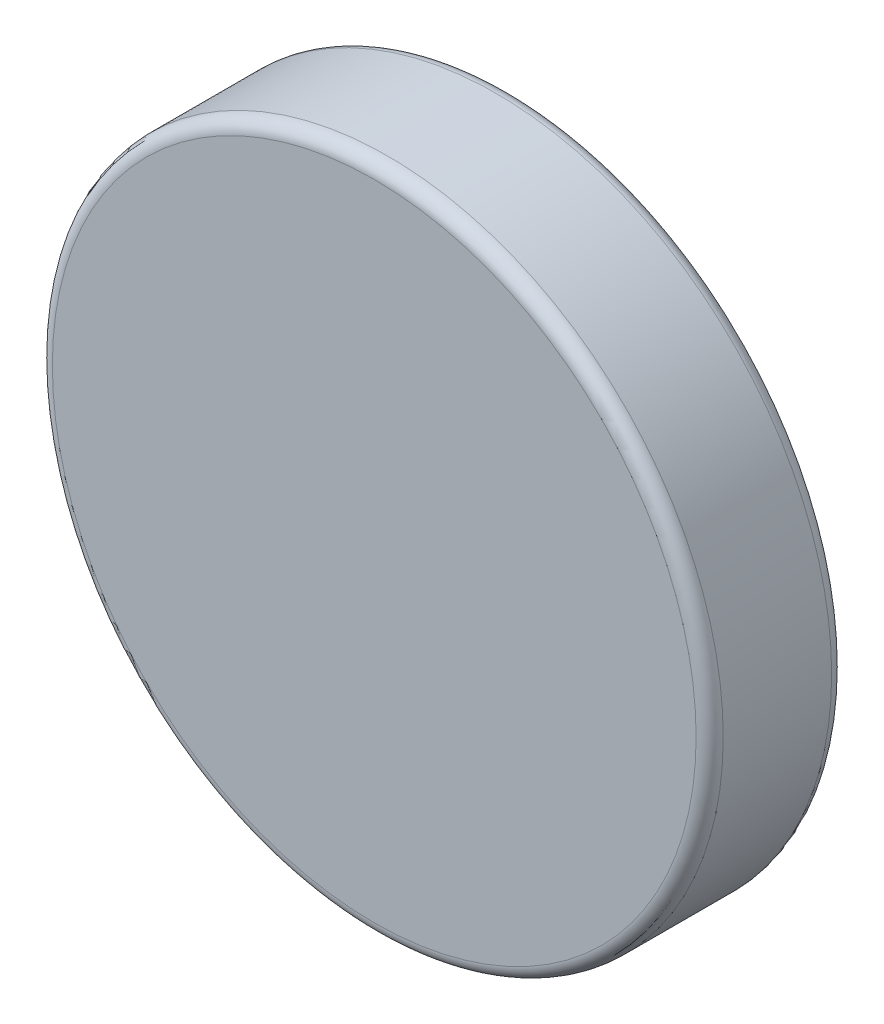
ISO-10303-21;
HEADER;
FILE_DESCRIPTION(('STEP AP214'),'2;1');
FILE_NAME('part.step','',(''),(''),'','','');
FILE_SCHEMA(('AUTOMOTIVE_DESIGN { 1 0 10303 214 1 1 1 1 }'));
ENDSEC;
DATA;
#1=APPLICATION_CONTEXT('core data for automotive mechanical design processes');
#2=APPLICATION_PROTOCOL_DEFINITION('international standard','automotive_design',2000,#1);
#3=PRODUCT_CONTEXT('',#1,'mechanical');
#4=PRODUCT('Part','Part','',(#3));
#5=PRODUCT_RELATED_PRODUCT_CATEGORY('part','',(#4));
#6=PRODUCT_DEFINITION_FORMATION('','',#4);
#7=PRODUCT_DEFINITION_CONTEXT('part definition',#1,'design');
#8=PRODUCT_DEFINITION('design','',#6,#7);
#9=PRODUCT_DEFINITION_SHAPE('','',#8);
#10=(LENGTH_UNIT() NAMED_UNIT(*) SI_UNIT(.MILLI.,.METRE.));
#11=(NAMED_UNIT(*) PLANE_ANGLE_UNIT() SI_UNIT($,.RADIAN.));
#12=(NAMED_UNIT(*) SI_UNIT($,.STERADIAN.) SOLID_ANGLE_UNIT());
#13=UNCERTAINTY_MEASURE_WITH_UNIT(LENGTH_MEASURE(1.E-05),#10,'distance_accuracy_value','');
#14=(GEOMETRIC_REPRESENTATION_CONTEXT(3) GLOBAL_UNCERTAINTY_ASSIGNED_CONTEXT((#13)) GLOBAL_UNIT_ASSIGNED_CONTEXT((#10,
#11,#12)) REPRESENTATION_CONTEXT('',''));
#15=CARTESIAN_POINT('',(0.,0.,0.));
#16=DIRECTION('',(0.,0.,1.));
#17=DIRECTION('',(1.,0.,0.));
#18=AXIS2_PLACEMENT_3D('',#15,#16,#17);
#19=CARTESIAN_POINT('',(0.,0.,2.));
#20=DIRECTION('',(0.,0.,-1.));
#21=DIRECTION('',(-1.,0.,0.));
#22=AXIS2_PLACEMENT_3D('',#19,#20,#21);
#23=CYLINDRICAL_SURFACE('',#22,4.95);
#24=CARTESIAN_POINT('',(0.,0.,0.2));
#25=DIRECTION('',(0.,0.,1.));
#26=DIRECTION('',(1.,0.,0.));
#27=AXIS2_PLACEMENT_3D('',#24,#25,#26);
#28=CIRCLE('',#27,4.95);
#29=CARTESIAN_POINT('',(4.95,0.,0.2));
#30=VERTEX_POINT('',#29);
#31=EDGE_CURVE('E42',#30,#30,#28,.T.);
#32=ORIENTED_EDGE('',*,*,#31,.T.);
#33=EDGE_LOOP('',(#32));
#34=FACE_BOUND('',#33,.T.);
#35=CARTESIAN_POINT('',(0.,0.,1.8));
#36=DIRECTION('',(0.,0.,1.));
#37=DIRECTION('',(1.,0.,0.));
#38=AXIS2_PLACEMENT_3D('',#35,#36,#37);
#39=CIRCLE('',#38,4.95);
#40=CARTESIAN_POINT('',(4.95,0.,1.8));
#41=VERTEX_POINT('',#40);
#42=EDGE_CURVE('E46',#41,#41,#39,.F.);
#43=ORIENTED_EDGE('',*,*,#42,.T.);
#44=EDGE_LOOP('',(#43));
#45=FACE_BOUND('',#44,.T.);
#46=ADVANCED_FACE('F31',(#34,#45),#23,.T.);
#47=CARTESIAN_POINT('',(0.,0.,2.));
#48=DIRECTION('',(0.,0.,1.));
#49=DIRECTION('',(1.,0.,0.));
#50=AXIS2_PLACEMENT_3D('',#47,#48,#49);
#51=PLANE('',#50);
#52=CARTESIAN_POINT('',(0.,0.,2.));
#53=DIRECTION('',(0.,0.,1.));
#54=DIRECTION('',(1.,0.,0.));
#55=AXIS2_PLACEMENT_3D('',#52,#53,#54);
#56=CIRCLE('',#55,4.75);
#57=CARTESIAN_POINT('',(4.75,0.,2.));
#58=VERTEX_POINT('',#57);
#59=EDGE_CURVE('E10',#58,#58,#56,.T.);
#60=ORIENTED_EDGE('',*,*,#59,.T.);
#61=EDGE_LOOP('',(#60));
#62=FACE_BOUND('',#61,.T.);
#63=ADVANCED_FACE('F62',(#62),#51,.T.);
#64=CARTESIAN_POINT('',(0.,0.,0.));
#65=DIRECTION('',(0.,0.,1.));
#66=DIRECTION('',(1.,0.,0.));
#67=AXIS2_PLACEMENT_3D('',#64,#65,#66);
#68=PLANE('',#67);
#69=CARTESIAN_POINT('',(0.,0.,0.));
#70=DIRECTION('',(0.,0.,1.));
#71=DIRECTION('',(1.,0.,0.));
#72=AXIS2_PLACEMENT_3D('',#69,#70,#71);
#73=CIRCLE('',#72,4.75);
#74=CARTESIAN_POINT('',(4.75,0.,0.));
#75=VERTEX_POINT('',#74);
#76=EDGE_CURVE('E38',#75,#75,#73,.F.);
#77=ORIENTED_EDGE('',*,*,#76,.T.);
#78=EDGE_LOOP('',(#77));
#79=FACE_BOUND('',#78,.T.);
#80=ADVANCED_FACE('F59',(#79),#68,.F.);
#81=CARTESIAN_POINT('',(0.,0.,0.2));
#82=DIRECTION('',(0.,0.,1.));
#83=DIRECTION('',(1.,0.,0.));
#84=AXIS2_PLACEMENT_3D('',#81,#82,#83);
#85=TOROIDAL_SURFACE('',#84,4.75,0.2);
#86=ORIENTED_EDGE('',*,*,#76,.F.);
#87=EDGE_LOOP('',(#86));
#88=FACE_BOUND('',#87,.T.);
#89=ORIENTED_EDGE('',*,*,#31,.F.);
#90=EDGE_LOOP('',(#89));
#91=FACE_BOUND('',#90,.T.);
#92=ADVANCED_FACE('F55',(#88,#91),#85,.T.);
#93=CARTESIAN_POINT('',(0.,0.,1.8));
#94=DIRECTION('',(0.,0.,1.));
#95=DIRECTION('',(1.,0.,0.));
#96=AXIS2_PLACEMENT_3D('',#93,#94,#95);
#97=TOROIDAL_SURFACE('',#96,4.75,0.2);
#98=ORIENTED_EDGE('',*,*,#42,.F.);
#99=EDGE_LOOP('',(#98));
#100=FACE_BOUND('',#99,.T.);
#101=ORIENTED_EDGE('',*,*,#59,.F.);
#102=EDGE_LOOP('',(#101));
#103=FACE_BOUND('',#102,.T.);
#104=ADVANCED_FACE('F33',(#100,#103),#97,.T.);
#105=CLOSED_SHELL('',(#46,#63,#80,#92,#104));
#106=MANIFOLD_SOLID_BREP('B2',#105);
#107=ADVANCED_BREP_SHAPE_REPRESENTATION('',(#18,#106),#14);
#108=SHAPE_DEFINITION_REPRESENTATION(#9,#107);
ENDSEC;
END-ISO-10303-21;
